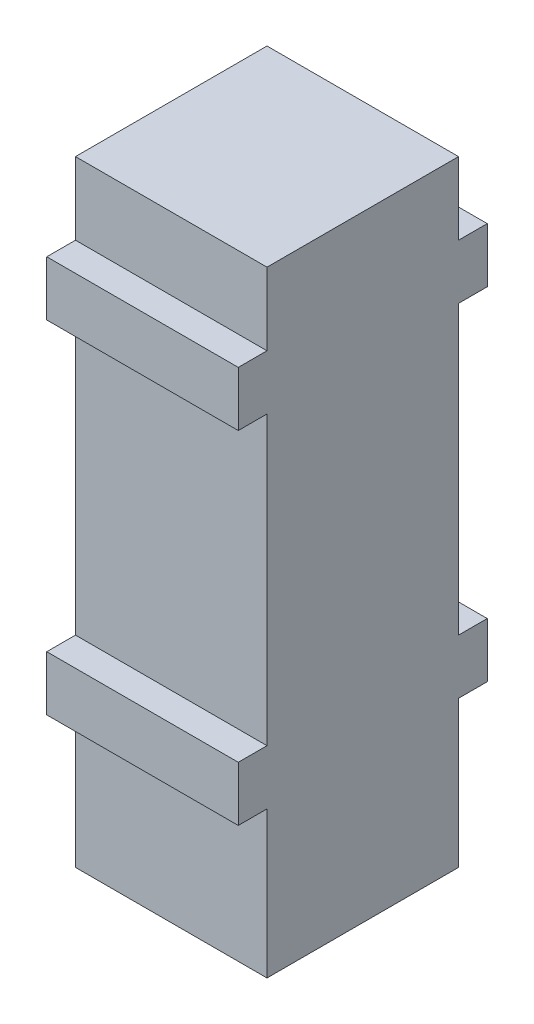
ISO-10303-21;
HEADER;
FILE_DESCRIPTION(('STEP AP214'),'2;1');
FILE_NAME('part.step','',(''),(''),'','','');
FILE_SCHEMA(('AUTOMOTIVE_DESIGN { 1 0 10303 214 1 1 1 1 }'));
ENDSEC;
DATA;
#1=APPLICATION_CONTEXT('core data for automotive mechanical design processes');
#2=APPLICATION_PROTOCOL_DEFINITION('international standard','automotive_design',2000,#1);
#3=PRODUCT_CONTEXT('',#1,'mechanical');
#4=PRODUCT('Part','Part','',(#3));
#5=PRODUCT_RELATED_PRODUCT_CATEGORY('part','',(#4));
#6=PRODUCT_DEFINITION_FORMATION('','',#4);
#7=PRODUCT_DEFINITION_CONTEXT('part definition',#1,'design');
#8=PRODUCT_DEFINITION('design','',#6,#7);
#9=PRODUCT_DEFINITION_SHAPE('','',#8);
#10=(LENGTH_UNIT() NAMED_UNIT(*) SI_UNIT(.MILLI.,.METRE.));
#11=(NAMED_UNIT(*) PLANE_ANGLE_UNIT() SI_UNIT($,.RADIAN.));
#12=(NAMED_UNIT(*) SI_UNIT($,.STERADIAN.) SOLID_ANGLE_UNIT());
#13=UNCERTAINTY_MEASURE_WITH_UNIT(LENGTH_MEASURE(1.E-05),#10,'distance_accuracy_value','');
#14=(GEOMETRIC_REPRESENTATION_CONTEXT(3) GLOBAL_UNCERTAINTY_ASSIGNED_CONTEXT((#13)) GLOBAL_UNIT_ASSIGNED_CONTEXT((#10,
#11,#12)) REPRESENTATION_CONTEXT('',''));
#15=CARTESIAN_POINT('',(0.,0.,0.));
#16=DIRECTION('',(0.,0.,1.));
#17=DIRECTION('',(1.,0.,0.));
#18=AXIS2_PLACEMENT_3D('',#15,#16,#17);
#19=CARTESIAN_POINT('',(0.,45.,0.));
#20=DIRECTION('',(0.,0.,-1.));
#21=DIRECTION('',(-1.,0.,0.));
#22=AXIS2_PLACEMENT_3D('',#19,#20,#21);
#23=PLANE('',#22);
#24=DIRECTION('',(0.,-1.,0.));
#25=VECTOR('',#24,1.);
#26=CARTESIAN_POINT('',(0.,45.,0.));
#27=LINE('',#26,#25);
#28=CARTESIAN_POINT('',(0.,35.7063445827793,0.));
#29=VERTEX_POINT('',#28);
#30=CARTESIAN_POINT('',(0.,14.706344582779,0.));
#31=VERTEX_POINT('',#30);
#32=EDGE_CURVE('E41',#29,#31,#27,.T.);
#33=ORIENTED_EDGE('',*,*,#32,.T.);
#34=DIRECTION('',(1.,0.,0.));
#35=VECTOR('',#34,1.);
#36=CARTESIAN_POINT('',(14.,14.706344582779,0.));
#37=LINE('',#36,#35);
#38=CARTESIAN_POINT('',(14.,14.706344582779,0.));
#39=VERTEX_POINT('',#38);
#40=EDGE_CURVE('E203',#31,#39,#37,.T.);
#41=ORIENTED_EDGE('',*,*,#40,.T.);
#42=DIRECTION('',(0.,-1.,0.));
#43=VECTOR('',#42,1.);
#44=CARTESIAN_POINT('',(14.,45.,0.));
#45=LINE('',#44,#43);
#46=CARTESIAN_POINT('',(14.,35.7063445827793,0.));
#47=VERTEX_POINT('',#46);
#48=EDGE_CURVE('E179',#47,#39,#45,.T.);
#49=ORIENTED_EDGE('',*,*,#48,.F.);
#50=DIRECTION('',(-1.,0.,0.));
#51=VECTOR('',#50,1.);
#52=CARTESIAN_POINT('',(14.,35.7063445827793,0.));
#53=LINE('',#52,#51);
#54=EDGE_CURVE('E214',#47,#29,#53,.T.);
#55=ORIENTED_EDGE('',*,*,#54,.T.);
#56=EDGE_LOOP('',(#33,#41,#49,#55));
#57=FACE_BOUND('',#56,.T.);
#58=ADVANCED_FACE('F33',(#57),#23,.F.);
#59=CARTESIAN_POINT('',(14.,10.7063445827793,0.));
#60=VERTEX_POINT('',#59);
#61=CARTESIAN_POINT('',(14.,0.,0.));
#62=VERTEX_POINT('',#61);
#63=EDGE_CURVE('E313',#60,#62,#45,.T.);
#64=ORIENTED_EDGE('',*,*,#63,.F.);
#65=DIRECTION('',(-1.,0.,0.));
#66=VECTOR('',#65,1.);
#67=CARTESIAN_POINT('',(14.,10.7063445827793,0.));
#68=LINE('',#67,#66);
#69=CARTESIAN_POINT('',(0.,10.7063445827793,0.));
#70=VERTEX_POINT('',#69);
#71=EDGE_CURVE('E49',#60,#70,#68,.T.);
#72=ORIENTED_EDGE('',*,*,#71,.T.);
#73=CARTESIAN_POINT('',(0.,0.,0.));
#74=VERTEX_POINT('',#73);
#75=EDGE_CURVE('E42',#70,#74,#27,.T.);
#76=ORIENTED_EDGE('',*,*,#75,.T.);
#77=DIRECTION('',(1.,0.,0.));
#78=VECTOR('',#77,1.);
#79=CARTESIAN_POINT('',(0.,0.,0.));
#80=LINE('',#79,#78);
#81=EDGE_CURVE('E300',#74,#62,#80,.T.);
#82=ORIENTED_EDGE('',*,*,#81,.T.);
#83=EDGE_LOOP('',(#64,#72,#76,#82));
#84=FACE_BOUND('',#83,.T.);
#85=ADVANCED_FACE('F324',(#84),#23,.F.);
#86=CARTESIAN_POINT('',(0.,45.,-14.));
#87=DIRECTION('',(0.,0.,1.));
#88=DIRECTION('',(1.,0.,0.));
#89=AXIS2_PLACEMENT_3D('',#86,#87,#88);
#90=PLANE('',#89);
#91=DIRECTION('',(-1.,0.,0.));
#92=VECTOR('',#91,1.);
#93=CARTESIAN_POINT('',(14.,10.7063445827793,-14.));
#94=LINE('',#93,#92);
#95=CARTESIAN_POINT('',(14.,10.7063445827793,-14.));
#96=VERTEX_POINT('',#95);
#97=CARTESIAN_POINT('',(0.,10.7063445827793,-14.));
#98=VERTEX_POINT('',#97);
#99=EDGE_CURVE('E232',#96,#98,#94,.T.);
#100=ORIENTED_EDGE('',*,*,#99,.F.);
#101=DIRECTION('',(0.,-1.,0.));
#102=VECTOR('',#101,1.);
#103=CARTESIAN_POINT('',(14.,45.,-14.));
#104=LINE('',#103,#102);
#105=CARTESIAN_POINT('',(14.,0.,-14.));
#106=VERTEX_POINT('',#105);
#107=EDGE_CURVE('E310',#96,#106,#104,.T.);
#108=ORIENTED_EDGE('',*,*,#107,.T.);
#109=DIRECTION('',(-1.,0.,0.));
#110=VECTOR('',#109,1.);
#111=CARTESIAN_POINT('',(0.,0.,-14.));
#112=LINE('',#111,#110);
#113=CARTESIAN_POINT('',(0.,0.,-14.));
#114=VERTEX_POINT('',#113);
#115=EDGE_CURVE('E291',#106,#114,#112,.T.);
#116=ORIENTED_EDGE('',*,*,#115,.T.);
#117=DIRECTION('',(0.,-1.,0.));
#118=VECTOR('',#117,1.);
#119=CARTESIAN_POINT('',(0.,45.,-14.));
#120=LINE('',#119,#118);
#121=EDGE_CURVE('E297',#98,#114,#120,.T.);
#122=ORIENTED_EDGE('',*,*,#121,.F.);
#123=EDGE_LOOP('',(#100,#108,#116,#122));
#124=FACE_BOUND('',#123,.T.);
#125=ADVANCED_FACE('F331',(#124),#90,.F.);
#126=DIRECTION('',(1.,0.,0.));
#127=VECTOR('',#126,1.);
#128=CARTESIAN_POINT('',(14.,14.706344582779,-14.));
#129=LINE('',#128,#127);
#130=CARTESIAN_POINT('',(0.,14.706344582779,-14.));
#131=VERTEX_POINT('',#130);
#132=CARTESIAN_POINT('',(14.,14.706344582779,-14.));
#133=VERTEX_POINT('',#132);
#134=EDGE_CURVE('E237',#131,#133,#129,.T.);
#135=ORIENTED_EDGE('',*,*,#134,.F.);
#136=CARTESIAN_POINT('',(0.,35.7063445827793,-14.));
#137=VERTEX_POINT('',#136);
#138=EDGE_CURVE('E311',#137,#131,#120,.T.);
#139=ORIENTED_EDGE('',*,*,#138,.F.);
#140=DIRECTION('',(-1.,0.,0.));
#141=VECTOR('',#140,1.);
#142=CARTESIAN_POINT('',(14.,35.7063445827793,-14.));
#143=LINE('',#142,#141);
#144=CARTESIAN_POINT('',(14.,35.7063445827793,-14.));
#145=VERTEX_POINT('',#144);
#146=EDGE_CURVE('E259',#145,#137,#143,.T.);
#147=ORIENTED_EDGE('',*,*,#146,.F.);
#148=EDGE_CURVE('E314',#145,#133,#104,.T.);
#149=ORIENTED_EDGE('',*,*,#148,.T.);
#150=EDGE_LOOP('',(#135,#139,#147,#149));
#151=FACE_BOUND('',#150,.T.);
#152=ADVANCED_FACE('F335',(#151),#90,.F.);
#153=DIRECTION('',(1.,0.,0.));
#154=VECTOR('',#153,1.);
#155=CARTESIAN_POINT('',(14.,39.706344582779,-14.));
#156=LINE('',#155,#154);
#157=CARTESIAN_POINT('',(0.,39.706344582779,-14.));
#158=VERTEX_POINT('',#157);
#159=CARTESIAN_POINT('',(14.,39.706344582779,-14.));
#160=VERTEX_POINT('',#159);
#161=EDGE_CURVE('E264',#158,#160,#156,.T.);
#162=ORIENTED_EDGE('',*,*,#161,.F.);
#163=CARTESIAN_POINT('',(0.,45.,-14.));
#164=VERTEX_POINT('',#163);
#165=EDGE_CURVE('E307',#164,#158,#120,.T.);
#166=ORIENTED_EDGE('',*,*,#165,.F.);
#167=DIRECTION('',(-1.,0.,0.));
#168=VECTOR('',#167,1.);
#169=CARTESIAN_POINT('',(0.,45.,-14.));
#170=LINE('',#169,#168);
#171=CARTESIAN_POINT('',(14.,45.,-14.));
#172=VERTEX_POINT('',#171);
#173=EDGE_CURVE('E295',#172,#164,#170,.T.);
#174=ORIENTED_EDGE('',*,*,#173,.F.);
#175=EDGE_CURVE('E312',#172,#160,#104,.T.);
#176=ORIENTED_EDGE('',*,*,#175,.T.);
#177=EDGE_LOOP('',(#162,#166,#174,#176));
#178=FACE_BOUND('',#177,.T.);
#179=ADVANCED_FACE('F379',(#178),#90,.F.);
#180=CARTESIAN_POINT('',(0.,45.,0.));
#181=DIRECTION('',(1.,0.,0.));
#182=DIRECTION('',(0.,0.,-1.));
#183=AXIS2_PLACEMENT_3D('',#180,#181,#182);
#184=PLANE('',#183);
#185=DIRECTION('',(0.,0.,1.));
#186=VECTOR('',#185,1.);
#187=CARTESIAN_POINT('',(0.,0.,0.));
#188=LINE('',#187,#186);
#189=EDGE_CURVE('E286',#114,#74,#188,.T.);
#190=ORIENTED_EDGE('',*,*,#189,.T.);
#191=ORIENTED_EDGE('',*,*,#75,.F.);
#192=DIRECTION('',(0.,0.,-1.));
#193=VECTOR('',#192,1.);
#194=CARTESIAN_POINT('',(0.,10.7063445827793,2.1));
#195=LINE('',#194,#193);
#196=CARTESIAN_POINT('',(0.,10.7063445827793,2.1));
#197=VERTEX_POINT('',#196);
#198=EDGE_CURVE('E207',#197,#70,#195,.T.);
#199=ORIENTED_EDGE('',*,*,#198,.F.);
#200=DIRECTION('',(0.,1.,0.));
#201=VECTOR('',#200,1.);
#202=CARTESIAN_POINT('',(0.,14.706344582779,2.1));
#203=LINE('',#202,#201);
#204=CARTESIAN_POINT('',(0.,14.706344582779,2.1));
#205=VERTEX_POINT('',#204);
#206=EDGE_CURVE('E197',#197,#205,#203,.T.);
#207=ORIENTED_EDGE('',*,*,#206,.T.);
#208=DIRECTION('',(0.,0.,-1.));
#209=VECTOR('',#208,1.);
#210=CARTESIAN_POINT('',(0.,14.706344582779,2.1));
#211=LINE('',#210,#209);
#212=EDGE_CURVE('E185',#205,#31,#211,.T.);
#213=ORIENTED_EDGE('',*,*,#212,.T.);
#214=ORIENTED_EDGE('',*,*,#32,.F.);
#215=DIRECTION('',(0.,0.,-1.));
#216=VECTOR('',#215,1.);
#217=CARTESIAN_POINT('',(0.,35.7063445827793,2.1));
#218=LINE('',#217,#216);
#219=CARTESIAN_POINT('',(0.,35.7063445827793,2.1));
#220=VERTEX_POINT('',#219);
#221=EDGE_CURVE('E227',#220,#29,#218,.T.);
#222=ORIENTED_EDGE('',*,*,#221,.F.);
#223=DIRECTION('',(0.,1.,0.));
#224=VECTOR('',#223,1.);
#225=CARTESIAN_POINT('',(0.,35.7063445827793,2.1));
#226=LINE('',#225,#224);
#227=CARTESIAN_POINT('',(0.,39.706344582779,2.1));
#228=VERTEX_POINT('',#227);
#229=EDGE_CURVE('E216',#220,#228,#226,.T.);
#230=ORIENTED_EDGE('',*,*,#229,.T.);
#231=DIRECTION('',(0.,0.,-1.));
#232=VECTOR('',#231,1.);
#233=CARTESIAN_POINT('',(0.,39.706344582779,2.1));
#234=LINE('',#233,#232);
#235=CARTESIAN_POINT('',(0.,39.706344582779,0.));
#236=VERTEX_POINT('',#235);
#237=EDGE_CURVE('E229',#228,#236,#234,.T.);
#238=ORIENTED_EDGE('',*,*,#237,.T.);
#239=CARTESIAN_POINT('',(0.,45.,0.));
#240=VERTEX_POINT('',#239);
#241=EDGE_CURVE('E11',#240,#236,#27,.T.);
#242=ORIENTED_EDGE('',*,*,#241,.F.);
#243=DIRECTION('',(0.,0.,1.));
#244=VECTOR('',#243,1.);
#245=CARTESIAN_POINT('',(0.,45.,0.));
#246=LINE('',#245,#244);
#247=EDGE_CURVE('E287',#164,#240,#246,.T.);
#248=ORIENTED_EDGE('',*,*,#247,.F.);
#249=ORIENTED_EDGE('',*,*,#165,.T.);
#250=DIRECTION('',(0.,0.,1.));
#251=VECTOR('',#250,1.);
#252=CARTESIAN_POINT('',(0.,39.706344582779,-16.1));
#253=LINE('',#252,#251);
#254=CARTESIAN_POINT('',(0.,39.706344582779,-16.1));
#255=VERTEX_POINT('',#254);
#256=EDGE_CURVE('E277',#255,#158,#253,.T.);
#257=ORIENTED_EDGE('',*,*,#256,.F.);
#258=DIRECTION('',(0.,1.,0.));
#259=VECTOR('',#258,1.);
#260=CARTESIAN_POINT('',(0.,35.7063445827793,-16.1));
#261=LINE('',#260,#259);
#262=CARTESIAN_POINT('',(0.,35.7063445827793,-16.1));
#263=VERTEX_POINT('',#262);
#264=EDGE_CURVE('E266',#263,#255,#261,.T.);
#265=ORIENTED_EDGE('',*,*,#264,.F.);
#266=DIRECTION('',(0.,0.,1.));
#267=VECTOR('',#266,1.);
#268=CARTESIAN_POINT('',(0.,35.7063445827793,-16.1));
#269=LINE('',#268,#267);
#270=EDGE_CURVE('E280',#263,#137,#269,.T.);
#271=ORIENTED_EDGE('',*,*,#270,.T.);
#272=ORIENTED_EDGE('',*,*,#138,.T.);
#273=DIRECTION('',(0.,0.,1.));
#274=VECTOR('',#273,1.);
#275=CARTESIAN_POINT('',(0.,14.706344582779,-16.1));
#276=LINE('',#275,#274);
#277=CARTESIAN_POINT('',(0.,14.706344582779,-16.1));
#278=VERTEX_POINT('',#277);
#279=EDGE_CURVE('E250',#278,#131,#276,.T.);
#280=ORIENTED_EDGE('',*,*,#279,.F.);
#281=DIRECTION('',(0.,1.,0.));
#282=VECTOR('',#281,1.);
#283=CARTESIAN_POINT('',(0.,14.706344582779,-16.1));
#284=LINE('',#283,#282);
#285=CARTESIAN_POINT('',(0.,10.7063445827793,-16.1));
#286=VERTEX_POINT('',#285);
#287=EDGE_CURVE('E239',#286,#278,#284,.T.);
#288=ORIENTED_EDGE('',*,*,#287,.F.);
#289=DIRECTION('',(0.,0.,1.));
#290=VECTOR('',#289,1.);
#291=CARTESIAN_POINT('',(0.,10.7063445827793,-16.1));
#292=LINE('',#291,#290);
#293=EDGE_CURVE('E253',#286,#98,#292,.T.);
#294=ORIENTED_EDGE('',*,*,#293,.T.);
#295=ORIENTED_EDGE('',*,*,#121,.T.);
#296=EDGE_LOOP('',(#190,#191,#199,#207,#213,#214,#222,#230,#238,#242,#248,#249,#257,#265,#271,
#272,#280,#288,#294,#295));
#297=FACE_BOUND('',#296,.T.);
#298=ADVANCED_FACE('F35',(#297),#184,.F.);
#299=ORIENTED_EDGE('',*,*,#241,.T.);
#300=DIRECTION('',(1.,0.,0.));
#301=VECTOR('',#300,1.);
#302=CARTESIAN_POINT('',(14.,39.706344582779,0.));
#303=LINE('',#302,#301);
#304=CARTESIAN_POINT('',(14.,39.706344582779,0.));
#305=VERTEX_POINT('',#304);
#306=EDGE_CURVE('E184',#236,#305,#303,.T.);
#307=ORIENTED_EDGE('',*,*,#306,.T.);
#308=CARTESIAN_POINT('',(14.,45.,0.));
#309=VERTEX_POINT('',#308);
#310=EDGE_CURVE('E315',#309,#305,#45,.T.);
#311=ORIENTED_EDGE('',*,*,#310,.F.);
#312=DIRECTION('',(1.,0.,0.));
#313=VECTOR('',#312,1.);
#314=CARTESIAN_POINT('',(0.,45.,0.));
#315=LINE('',#314,#313);
#316=EDGE_CURVE('E290',#240,#309,#315,.T.);
#317=ORIENTED_EDGE('',*,*,#316,.F.);
#318=EDGE_LOOP('',(#299,#307,#311,#317));
#319=FACE_BOUND('',#318,.T.);
#320=ADVANCED_FACE('F366',(#319),#23,.F.);
#321=CARTESIAN_POINT('',(14.,45.,0.));
#322=DIRECTION('',(-1.,0.,0.));
#323=DIRECTION('',(0.,0.,1.));
#324=AXIS2_PLACEMENT_3D('',#321,#322,#323);
#325=PLANE('',#324);
#326=DIRECTION('',(0.,0.,-1.));
#327=VECTOR('',#326,1.);
#328=CARTESIAN_POINT('',(14.,0.,0.));
#329=LINE('',#328,#327);
#330=EDGE_CURVE('E303',#62,#106,#329,.T.);
#331=ORIENTED_EDGE('',*,*,#330,.T.);
#332=ORIENTED_EDGE('',*,*,#107,.F.);
#333=DIRECTION('',(0.,0.,1.));
#334=VECTOR('',#333,1.);
#335=CARTESIAN_POINT('',(14.,10.7063445827793,-16.1));
#336=LINE('',#335,#334);
#337=CARTESIAN_POINT('',(14.,10.7063445827793,-16.1));
#338=VERTEX_POINT('',#337);
#339=EDGE_CURVE('E256',#338,#96,#336,.T.);
#340=ORIENTED_EDGE('',*,*,#339,.F.);
#341=DIRECTION('',(0.,-1.,0.));
#342=VECTOR('',#341,1.);
#343=CARTESIAN_POINT('',(14.,14.706344582779,-16.1));
#344=LINE('',#343,#342);
#345=CARTESIAN_POINT('',(14.,14.706344582779,-16.1));
#346=VERTEX_POINT('',#345);
#347=EDGE_CURVE('E233',#346,#338,#344,.T.);
#348=ORIENTED_EDGE('',*,*,#347,.F.);
#349=DIRECTION('',(0.,0.,1.));
#350=VECTOR('',#349,1.);
#351=CARTESIAN_POINT('',(14.,14.706344582779,-16.1));
#352=LINE('',#351,#350);
#353=EDGE_CURVE('E243',#346,#133,#352,.T.);
#354=ORIENTED_EDGE('',*,*,#353,.T.);
#355=ORIENTED_EDGE('',*,*,#148,.F.);
#356=DIRECTION('',(0.,0.,1.));
#357=VECTOR('',#356,1.);
#358=CARTESIAN_POINT('',(14.,35.7063445827793,-16.1));
#359=LINE('',#358,#357);
#360=CARTESIAN_POINT('',(14.,35.7063445827793,-16.1));
#361=VERTEX_POINT('',#360);
#362=EDGE_CURVE('E283',#361,#145,#359,.T.);
#363=ORIENTED_EDGE('',*,*,#362,.F.);
#364=DIRECTION('',(0.,-1.,0.));
#365=VECTOR('',#364,1.);
#366=CARTESIAN_POINT('',(14.,35.7063445827793,-16.1));
#367=LINE('',#366,#365);
#368=CARTESIAN_POINT('',(14.,39.706344582779,-16.1));
#369=VERTEX_POINT('',#368);
#370=EDGE_CURVE('E260',#369,#361,#367,.T.);
#371=ORIENTED_EDGE('',*,*,#370,.F.);
#372=DIRECTION('',(0.,0.,1.));
#373=VECTOR('',#372,1.);
#374=CARTESIAN_POINT('',(14.,39.706344582779,-16.1));
#375=LINE('',#374,#373);
#376=EDGE_CURVE('E270',#369,#160,#375,.T.);
#377=ORIENTED_EDGE('',*,*,#376,.T.);
#378=ORIENTED_EDGE('',*,*,#175,.F.);
#379=DIRECTION('',(0.,0.,-1.));
#380=VECTOR('',#379,1.);
#381=CARTESIAN_POINT('',(14.,45.,0.));
#382=LINE('',#381,#380);
#383=EDGE_CURVE('E293',#309,#172,#382,.T.);
#384=ORIENTED_EDGE('',*,*,#383,.F.);
#385=ORIENTED_EDGE('',*,*,#310,.T.);
#386=DIRECTION('',(0.,0.,-1.));
#387=VECTOR('',#386,1.);
#388=CARTESIAN_POINT('',(14.,39.706344582779,2.1));
#389=LINE('',#388,#387);
#390=CARTESIAN_POINT('',(14.,39.706344582779,2.1));
#391=VERTEX_POINT('',#390);
#392=EDGE_CURVE('E57',#391,#305,#389,.T.);
#393=ORIENTED_EDGE('',*,*,#392,.F.);
#394=DIRECTION('',(0.,-1.,0.));
#395=VECTOR('',#394,1.);
#396=CARTESIAN_POINT('',(14.,35.7063445827793,2.1));
#397=LINE('',#396,#395);
#398=CARTESIAN_POINT('',(14.,35.7063445827793,2.1));
#399=VERTEX_POINT('',#398);
#400=EDGE_CURVE('E210',#391,#399,#397,.T.);
#401=ORIENTED_EDGE('',*,*,#400,.T.);
#402=DIRECTION('',(0.,0.,-1.));
#403=VECTOR('',#402,1.);
#404=CARTESIAN_POINT('',(14.,35.7063445827793,2.1));
#405=LINE('',#404,#403);
#406=EDGE_CURVE('E222',#399,#47,#405,.T.);
#407=ORIENTED_EDGE('',*,*,#406,.T.);
#408=ORIENTED_EDGE('',*,*,#48,.T.);
#409=DIRECTION('',(0.,0.,-1.));
#410=VECTOR('',#409,1.);
#411=CARTESIAN_POINT('',(14.,14.706344582779,2.1));
#412=LINE('',#411,#410);
#413=CARTESIAN_POINT('',(14.,14.706344582779,2.1));
#414=VERTEX_POINT('',#413);
#415=EDGE_CURVE('E172',#414,#39,#412,.T.);
#416=ORIENTED_EDGE('',*,*,#415,.F.);
#417=DIRECTION('',(0.,-1.,0.));
#418=VECTOR('',#417,1.);
#419=CARTESIAN_POINT('',(14.,14.706344582779,2.1));
#420=LINE('',#419,#418);
#421=CARTESIAN_POINT('',(14.,10.7063445827793,2.1));
#422=VERTEX_POINT('',#421);
#423=EDGE_CURVE('E176',#414,#422,#420,.T.);
#424=ORIENTED_EDGE('',*,*,#423,.T.);
#425=DIRECTION('',(0.,0.,-1.));
#426=VECTOR('',#425,1.);
#427=CARTESIAN_POINT('',(14.,10.7063445827793,2.1));
#428=LINE('',#427,#426);
#429=EDGE_CURVE('E202',#422,#60,#428,.T.);
#430=ORIENTED_EDGE('',*,*,#429,.T.);
#431=ORIENTED_EDGE('',*,*,#63,.T.);
#432=EDGE_LOOP('',(#331,#332,#340,#348,#354,#355,#363,#371,#377,#378,#384,#385,#393,#401,#407,
#408,#416,#424,#430,#431));
#433=FACE_BOUND('',#432,.T.);
#434=ADVANCED_FACE('F175',(#433),#325,.F.);
#435=CARTESIAN_POINT('',(0.,45.,0.));
#436=DIRECTION('',(0.,-1.,0.));
#437=DIRECTION('',(0.,0.,-1.));
#438=AXIS2_PLACEMENT_3D('',#435,#436,#437);
#439=PLANE('',#438);
#440=ORIENTED_EDGE('',*,*,#247,.T.);
#441=ORIENTED_EDGE('',*,*,#316,.T.);
#442=ORIENTED_EDGE('',*,*,#383,.T.);
#443=ORIENTED_EDGE('',*,*,#173,.T.);
#444=EDGE_LOOP('',(#440,#441,#442,#443));
#445=FACE_BOUND('',#444,.T.);
#446=ADVANCED_FACE('F378',(#445),#439,.F.);
#447=CARTESIAN_POINT('',(0.,0.,0.));
#448=DIRECTION('',(0.,-1.,0.));
#449=DIRECTION('',(0.,0.,-1.));
#450=AXIS2_PLACEMENT_3D('',#447,#448,#449);
#451=PLANE('',#450);
#452=ORIENTED_EDGE('',*,*,#189,.F.);
#453=ORIENTED_EDGE('',*,*,#115,.F.);
#454=ORIENTED_EDGE('',*,*,#330,.F.);
#455=ORIENTED_EDGE('',*,*,#81,.F.);
#456=EDGE_LOOP('',(#452,#453,#454,#455));
#457=FACE_BOUND('',#456,.T.);
#458=ADVANCED_FACE('F328',(#457),#451,.T.);
#459=CARTESIAN_POINT('',(14.,35.7063445827793,-16.1));
#460=DIRECTION('',(0.,1.,0.));
#461=DIRECTION('',(0.,0.,1.));
#462=AXIS2_PLACEMENT_3D('',#459,#460,#461);
#463=PLANE('',#462);
#464=ORIENTED_EDGE('',*,*,#146,.T.);
#465=ORIENTED_EDGE('',*,*,#270,.F.);
#466=DIRECTION('',(-1.,0.,0.));
#467=VECTOR('',#466,1.);
#468=CARTESIAN_POINT('',(14.,35.7063445827793,-16.1));
#469=LINE('',#468,#467);
#470=EDGE_CURVE('E263',#361,#263,#469,.T.);
#471=ORIENTED_EDGE('',*,*,#470,.F.);
#472=ORIENTED_EDGE('',*,*,#362,.T.);
#473=EDGE_LOOP('',(#464,#465,#471,#472));
#474=FACE_BOUND('',#473,.T.);
#475=ADVANCED_FACE('F492',(#474),#463,.F.);
#476=CARTESIAN_POINT('',(14.,39.706344582779,-16.1));
#477=DIRECTION('',(0.,-1.,0.));
#478=DIRECTION('',(0.,0.,-1.));
#479=AXIS2_PLACEMENT_3D('',#476,#477,#478);
#480=PLANE('',#479);
#481=ORIENTED_EDGE('',*,*,#161,.T.);
#482=ORIENTED_EDGE('',*,*,#376,.F.);
#483=DIRECTION('',(1.,0.,0.));
#484=VECTOR('',#483,1.);
#485=CARTESIAN_POINT('',(14.,39.706344582779,-16.1));
#486=LINE('',#485,#484);
#487=EDGE_CURVE('E268',#255,#369,#486,.T.);
#488=ORIENTED_EDGE('',*,*,#487,.F.);
#489=ORIENTED_EDGE('',*,*,#256,.T.);
#490=EDGE_LOOP('',(#481,#482,#488,#489));
#491=FACE_BOUND('',#490,.T.);
#492=ADVANCED_FACE('F361',(#491),#480,.F.);
#493=CARTESIAN_POINT('',(0.,0.,-16.1));
#494=DIRECTION('',(0.,0.,1.));
#495=DIRECTION('',(1.,0.,0.));
#496=AXIS2_PLACEMENT_3D('',#493,#494,#495);
#497=PLANE('',#496);
#498=ORIENTED_EDGE('',*,*,#370,.T.);
#499=ORIENTED_EDGE('',*,*,#470,.T.);
#500=ORIENTED_EDGE('',*,*,#264,.T.);
#501=ORIENTED_EDGE('',*,*,#487,.T.);
#502=EDGE_LOOP('',(#498,#499,#500,#501));
#503=FACE_BOUND('',#502,.T.);
#504=ADVANCED_FACE('F354',(#503),#497,.F.);
#505=CARTESIAN_POINT('',(14.,10.7063445827793,-16.1));
#506=DIRECTION('',(0.,1.,0.));
#507=DIRECTION('',(0.,0.,1.));
#508=AXIS2_PLACEMENT_3D('',#505,#506,#507);
#509=PLANE('',#508);
#510=ORIENTED_EDGE('',*,*,#99,.T.);
#511=ORIENTED_EDGE('',*,*,#293,.F.);
#512=DIRECTION('',(-1.,0.,0.));
#513=VECTOR('',#512,1.);
#514=CARTESIAN_POINT('',(14.,10.7063445827793,-16.1));
#515=LINE('',#514,#513);
#516=EDGE_CURVE('E236',#338,#286,#515,.T.);
#517=ORIENTED_EDGE('',*,*,#516,.F.);
#518=ORIENTED_EDGE('',*,*,#339,.T.);
#519=EDGE_LOOP('',(#510,#511,#517,#518));
#520=FACE_BOUND('',#519,.T.);
#521=ADVANCED_FACE('F352',(#520),#509,.F.);
#522=CARTESIAN_POINT('',(14.,14.706344582779,-16.1));
#523=DIRECTION('',(0.,-1.,0.));
#524=DIRECTION('',(0.,0.,-1.));
#525=AXIS2_PLACEMENT_3D('',#522,#523,#524);
#526=PLANE('',#525);
#527=ORIENTED_EDGE('',*,*,#134,.T.);
#528=ORIENTED_EDGE('',*,*,#353,.F.);
#529=DIRECTION('',(1.,0.,0.));
#530=VECTOR('',#529,1.);
#531=CARTESIAN_POINT('',(14.,14.706344582779,-16.1));
#532=LINE('',#531,#530);
#533=EDGE_CURVE('E241',#278,#346,#532,.T.);
#534=ORIENTED_EDGE('',*,*,#533,.F.);
#535=ORIENTED_EDGE('',*,*,#279,.T.);
#536=EDGE_LOOP('',(#527,#528,#534,#535));
#537=FACE_BOUND('',#536,.T.);
#538=ADVANCED_FACE('F340',(#537),#526,.F.);
#539=CARTESIAN_POINT('',(0.,0.,-16.1));
#540=DIRECTION('',(0.,0.,-1.));
#541=DIRECTION('',(-1.,0.,0.));
#542=AXIS2_PLACEMENT_3D('',#539,#540,#541);
#543=PLANE('',#542);
#544=ORIENTED_EDGE('',*,*,#347,.T.);
#545=ORIENTED_EDGE('',*,*,#516,.T.);
#546=ORIENTED_EDGE('',*,*,#287,.T.);
#547=ORIENTED_EDGE('',*,*,#533,.T.);
#548=EDGE_LOOP('',(#544,#545,#546,#547));
#549=FACE_BOUND('',#548,.T.);
#550=ADVANCED_FACE('F345',(#549),#543,.T.);
#551=CARTESIAN_POINT('',(14.,39.706344582779,2.1));
#552=DIRECTION('',(0.,1.,0.));
#553=DIRECTION('',(0.,0.,1.));
#554=AXIS2_PLACEMENT_3D('',#551,#552,#553);
#555=PLANE('',#554);
#556=ORIENTED_EDGE('',*,*,#306,.F.);
#557=ORIENTED_EDGE('',*,*,#237,.F.);
#558=DIRECTION('',(1.,0.,0.));
#559=VECTOR('',#558,1.);
#560=CARTESIAN_POINT('',(14.,39.706344582779,2.1));
#561=LINE('',#560,#559);
#562=EDGE_CURVE('E213',#228,#391,#561,.T.);
#563=ORIENTED_EDGE('',*,*,#562,.T.);
#564=ORIENTED_EDGE('',*,*,#392,.T.);
#565=EDGE_LOOP('',(#556,#557,#563,#564));
#566=FACE_BOUND('',#565,.T.);
#567=ADVANCED_FACE('F384',(#566),#555,.T.);
#568=CARTESIAN_POINT('',(14.,35.7063445827793,2.1));
#569=DIRECTION('',(0.,-1.,0.));
#570=DIRECTION('',(0.,0.,-1.));
#571=AXIS2_PLACEMENT_3D('',#568,#569,#570);
#572=PLANE('',#571);
#573=ORIENTED_EDGE('',*,*,#54,.F.);
#574=ORIENTED_EDGE('',*,*,#406,.F.);
#575=DIRECTION('',(-1.,0.,0.));
#576=VECTOR('',#575,1.);
#577=CARTESIAN_POINT('',(14.,35.7063445827793,2.1));
#578=LINE('',#577,#576);
#579=EDGE_CURVE('E219',#399,#220,#578,.T.);
#580=ORIENTED_EDGE('',*,*,#579,.T.);
#581=ORIENTED_EDGE('',*,*,#221,.T.);
#582=EDGE_LOOP('',(#573,#574,#580,#581));
#583=FACE_BOUND('',#582,.T.);
#584=ADVANCED_FACE('F386',(#583),#572,.T.);
#585=CARTESIAN_POINT('',(0.,0.,2.1));
#586=DIRECTION('',(0.,0.,-1.));
#587=DIRECTION('',(1.,0.,0.));
#588=AXIS2_PLACEMENT_3D('',#585,#586,#587);
#589=PLANE('',#588);
#590=ORIENTED_EDGE('',*,*,#400,.F.);
#591=ORIENTED_EDGE('',*,*,#562,.F.);
#592=ORIENTED_EDGE('',*,*,#229,.F.);
#593=ORIENTED_EDGE('',*,*,#579,.F.);
#594=EDGE_LOOP('',(#590,#591,#592,#593));
#595=FACE_BOUND('',#594,.T.);
#596=ADVANCED_FACE('F392',(#595),#589,.F.);
#597=CARTESIAN_POINT('',(14.,14.706344582779,2.1));
#598=DIRECTION('',(0.,1.,0.));
#599=DIRECTION('',(0.,0.,1.));
#600=AXIS2_PLACEMENT_3D('',#597,#598,#599);
#601=PLANE('',#600);
#602=ORIENTED_EDGE('',*,*,#40,.F.);
#603=ORIENTED_EDGE('',*,*,#212,.F.);
#604=DIRECTION('',(1.,0.,0.));
#605=VECTOR('',#604,1.);
#606=CARTESIAN_POINT('',(14.,14.706344582779,2.1));
#607=LINE('',#606,#605);
#608=EDGE_CURVE('E191',#205,#414,#607,.T.);
#609=ORIENTED_EDGE('',*,*,#608,.T.);
#610=ORIENTED_EDGE('',*,*,#415,.T.);
#611=EDGE_LOOP('',(#602,#603,#609,#610));
#612=FACE_BOUND('',#611,.T.);
#613=ADVANCED_FACE('F196',(#612),#601,.T.);
#614=CARTESIAN_POINT('',(14.,10.7063445827793,2.1));
#615=DIRECTION('',(0.,-1.,0.));
#616=DIRECTION('',(0.,0.,-1.));
#617=AXIS2_PLACEMENT_3D('',#614,#615,#616);
#618=PLANE('',#617);
#619=ORIENTED_EDGE('',*,*,#71,.F.);
#620=ORIENTED_EDGE('',*,*,#429,.F.);
#621=DIRECTION('',(-1.,0.,0.));
#622=VECTOR('',#621,1.);
#623=CARTESIAN_POINT('',(14.,10.7063445827793,2.1));
#624=LINE('',#623,#622);
#625=EDGE_CURVE('E194',#422,#197,#624,.T.);
#626=ORIENTED_EDGE('',*,*,#625,.T.);
#627=ORIENTED_EDGE('',*,*,#198,.T.);
#628=EDGE_LOOP('',(#619,#620,#626,#627));
#629=FACE_BOUND('',#628,.T.);
#630=ADVANCED_FACE('F402',(#629),#618,.T.);
#631=CARTESIAN_POINT('',(0.,0.,2.1));
#632=DIRECTION('',(0.,0.,1.));
#633=DIRECTION('',(-1.,0.,0.));
#634=AXIS2_PLACEMENT_3D('',#631,#632,#633);
#635=PLANE('',#634);
#636=ORIENTED_EDGE('',*,*,#423,.F.);
#637=ORIENTED_EDGE('',*,*,#608,.F.);
#638=ORIENTED_EDGE('',*,*,#206,.F.);
#639=ORIENTED_EDGE('',*,*,#625,.F.);
#640=EDGE_LOOP('',(#636,#637,#638,#639));
#641=FACE_BOUND('',#640,.T.);
#642=ADVANCED_FACE('F189',(#641),#635,.T.);
#643=CLOSED_SHELL('',(#58,#85,#125,#152,#179,#298,#320,#434,#446,#458,#475,#492,#504,#521,#538,
#550,#567,#584,#596,#613,#630,#642));
#644=MANIFOLD_SOLID_BREP('B2',#643);
#645=ADVANCED_BREP_SHAPE_REPRESENTATION('',(#18,#644),#14);
#646=SHAPE_DEFINITION_REPRESENTATION(#9,#645);
ENDSEC;
END-ISO-10303-21;
